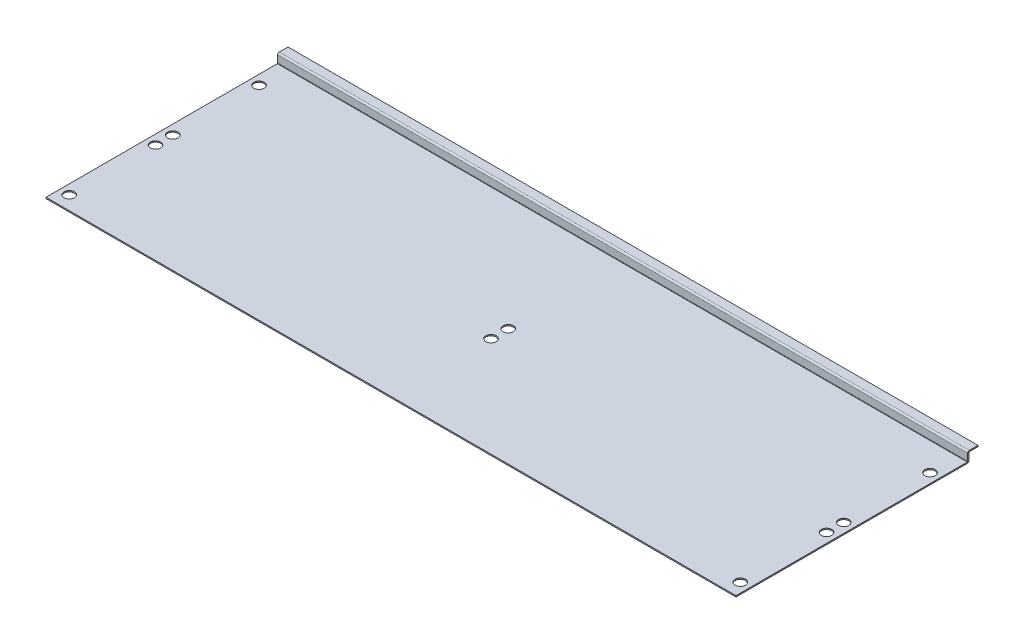
ISO-10303-21;
HEADER;
FILE_DESCRIPTION(('STEP AP214'),'2;1');
FILE_NAME('part.step','',(''),(''),'','','');
FILE_SCHEMA(('AUTOMOTIVE_DESIGN { 1 0 10303 214 1 1 1 1 }'));
ENDSEC;
DATA;
#1=APPLICATION_CONTEXT('core data for automotive mechanical design processes');
#2=APPLICATION_PROTOCOL_DEFINITION('international standard','automotive_design',2000,#1);
#3=PRODUCT_CONTEXT('',#1,'mechanical');
#4=PRODUCT('Part','Part','',(#3));
#5=PRODUCT_RELATED_PRODUCT_CATEGORY('part','',(#4));
#6=PRODUCT_DEFINITION_FORMATION('','',#4);
#7=PRODUCT_DEFINITION_CONTEXT('part definition',#1,'design');
#8=PRODUCT_DEFINITION('design','',#6,#7);
#9=PRODUCT_DEFINITION_SHAPE('','',#8);
#10=(LENGTH_UNIT() NAMED_UNIT(*) SI_UNIT(.MILLI.,.METRE.));
#11=(NAMED_UNIT(*) PLANE_ANGLE_UNIT() SI_UNIT($,.RADIAN.));
#12=(NAMED_UNIT(*) SI_UNIT($,.STERADIAN.) SOLID_ANGLE_UNIT());
#13=UNCERTAINTY_MEASURE_WITH_UNIT(LENGTH_MEASURE(1.E-05),#10,'distance_accuracy_value','');
#14=(GEOMETRIC_REPRESENTATION_CONTEXT(3) GLOBAL_UNCERTAINTY_ASSIGNED_CONTEXT((#13)) GLOBAL_UNIT_ASSIGNED_CONTEXT((#10,
#11,#12)) REPRESENTATION_CONTEXT('',''));
#15=CARTESIAN_POINT('',(0.,0.,0.));
#16=DIRECTION('',(0.,0.,1.));
#17=DIRECTION('',(1.,0.,0.));
#18=AXIS2_PLACEMENT_3D('',#15,#16,#17);
#19=CARTESIAN_POINT('',(200.,4.6,-67.5));
#20=DIRECTION('',(-1.,0.,0.));
#21=DIRECTION('',(0.,0.,1.));
#22=AXIS2_PLACEMENT_3D('',#19,#20,#21);
#23=PLANE('',#22);
#24=DIRECTION('',(0.,0.,1.));
#25=VECTOR('',#24,1.);
#26=CARTESIAN_POINT('',(200.,3.70000000000001,-67.5));
#27=LINE('',#26,#25);
#28=CARTESIAN_POINT('',(200.,3.70000000000001,-67.5));
#29=VERTEX_POINT('',#28);
#30=CARTESIAN_POINT('',(200.,3.70000000000001,-66.8));
#31=VERTEX_POINT('',#30);
#32=EDGE_CURVE('E247',#29,#31,#27,.T.);
#33=ORIENTED_EDGE('',*,*,#32,.T.);
#34=DIRECTION('',(0.,-1.,0.));
#35=VECTOR('',#34,1.);
#36=CARTESIAN_POINT('',(200.,4.6,-66.8));
#37=LINE('',#36,#35);
#38=CARTESIAN_POINT('',(200.,-0.499999999999987,-66.8));
#39=VERTEX_POINT('',#38);
#40=EDGE_CURVE('E268',#39,#31,#37,.F.);
#41=ORIENTED_EDGE('',*,*,#40,.F.);
#42=DIRECTION('',(0.,0.,1.));
#43=VECTOR('',#42,1.);
#44=CARTESIAN_POINT('',(200.,-0.499999999999988,-66.8));
#45=LINE('',#44,#43);
#46=CARTESIAN_POINT('',(200.,-0.499999999999993,-67.5));
#47=VERTEX_POINT('',#46);
#48=EDGE_CURVE('E276',#39,#47,#45,.F.);
#49=ORIENTED_EDGE('',*,*,#48,.T.);
#50=DIRECTION('',(0.,1.,0.));
#51=VECTOR('',#50,1.);
#52=CARTESIAN_POINT('',(200.,-1.40000000000018,-67.5));
#53=LINE('',#52,#51);
#54=EDGE_CURVE('E260',#47,#29,#53,.T.);
#55=ORIENTED_EDGE('',*,*,#54,.T.);
#56=EDGE_LOOP('',(#33,#41,#49,#55));
#57=FACE_BOUND('',#56,.T.);
#58=ADVANCED_FACE('F81',(#57),#23,.F.);
#59=CARTESIAN_POINT('',(-200.,-0.700000000000003,-67.5));
#60=DIRECTION('',(1.,0.,0.));
#61=DIRECTION('',(0.,0.,-1.));
#62=AXIS2_PLACEMENT_3D('',#59,#60,#61);
#63=PLANE('',#62);
#64=DIRECTION('',(0.,0.,1.));
#65=VECTOR('',#64,1.);
#66=CARTESIAN_POINT('',(-200.,3.70000000000001,-67.5));
#67=LINE('',#66,#65);
#68=CARTESIAN_POINT('',(-200.,3.70000000000001,-67.5));
#69=VERTEX_POINT('',#68);
#70=CARTESIAN_POINT('',(-200.,3.70000000000001,-66.8));
#71=VERTEX_POINT('',#70);
#72=EDGE_CURVE('E234',#69,#71,#67,.T.);
#73=ORIENTED_EDGE('',*,*,#72,.F.);
#74=DIRECTION('',(0.,-1.,0.));
#75=VECTOR('',#74,1.);
#76=CARTESIAN_POINT('',(-200.,-1.40000000000018,-67.5));
#77=LINE('',#76,#75);
#78=CARTESIAN_POINT('',(-200.,-0.499999999999989,-67.5));
#79=VERTEX_POINT('',#78);
#80=EDGE_CURVE('E255',#69,#79,#77,.T.);
#81=ORIENTED_EDGE('',*,*,#80,.T.);
#82=DIRECTION('',(0.,0.,1.));
#83=VECTOR('',#82,1.);
#84=CARTESIAN_POINT('',(-200.,-0.499999999999993,-67.5));
#85=LINE('',#84,#83);
#86=CARTESIAN_POINT('',(-200.,-0.499999999999987,-66.8));
#87=VERTEX_POINT('',#86);
#88=EDGE_CURVE('E251',#87,#79,#85,.F.);
#89=ORIENTED_EDGE('',*,*,#88,.F.);
#90=DIRECTION('',(0.,1.,0.));
#91=VECTOR('',#90,1.);
#92=CARTESIAN_POINT('',(-200.,-0.700000000000001,-66.8));
#93=LINE('',#92,#91);
#94=EDGE_CURVE('E264',#71,#87,#93,.F.);
#95=ORIENTED_EDGE('',*,*,#94,.F.);
#96=EDGE_LOOP('',(#73,#81,#89,#95));
#97=FACE_BOUND('',#96,.T.);
#98=ADVANCED_FACE('F449',(#97),#63,.F.);
#99=CARTESIAN_POINT('',(0.,-1.40000000000018,-67.5));
#100=DIRECTION('',(0.,0.,1.));
#101=DIRECTION('',(0.,1.,0.));
#102=AXIS2_PLACEMENT_3D('',#99,#100,#101);
#103=PLANE('',#102);
#104=DIRECTION('',(-1.,0.,0.));
#105=VECTOR('',#104,1.);
#106=CARTESIAN_POINT('',(-200.,3.70000000000001,-67.5));
#107=LINE('',#106,#105);
#108=EDGE_CURVE('E241',#69,#29,#107,.F.);
#109=ORIENTED_EDGE('',*,*,#108,.T.);
#110=ORIENTED_EDGE('',*,*,#54,.F.);
#111=DIRECTION('',(1.,0.,0.));
#112=VECTOR('',#111,1.);
#113=CARTESIAN_POINT('',(-200.,-0.499999999999993,-67.5));
#114=LINE('',#113,#112);
#115=EDGE_CURVE('E272',#47,#79,#114,.F.);
#116=ORIENTED_EDGE('',*,*,#115,.T.);
#117=ORIENTED_EDGE('',*,*,#80,.F.);
#118=EDGE_LOOP('',(#109,#110,#116,#117));
#119=FACE_BOUND('',#118,.T.);
#120=ADVANCED_FACE('F451',(#119),#103,.F.);
#121=CARTESIAN_POINT('',(0.,-1.40000000000018,-66.8));
#122=DIRECTION('',(0.,0.,1.));
#123=DIRECTION('',(0.,1.,0.));
#124=AXIS2_PLACEMENT_3D('',#121,#122,#123);
#125=PLANE('',#124);
#126=ORIENTED_EDGE('',*,*,#94,.T.);
#127=DIRECTION('',(1.,0.,0.));
#128=VECTOR('',#127,1.);
#129=CARTESIAN_POINT('',(-200.,-0.499999999999988,-66.8));
#130=LINE('',#129,#128);
#131=EDGE_CURVE('E280',#87,#39,#130,.T.);
#132=ORIENTED_EDGE('',*,*,#131,.T.);
#133=ORIENTED_EDGE('',*,*,#40,.T.);
#134=DIRECTION('',(-1.,0.,0.));
#135=VECTOR('',#134,1.);
#136=CARTESIAN_POINT('',(-200.,3.70000000000001,-66.8));
#137=LINE('',#136,#135);
#138=EDGE_CURVE('E228',#71,#31,#137,.F.);
#139=ORIENTED_EDGE('',*,*,#138,.F.);
#140=EDGE_LOOP('',(#126,#132,#133,#139));
#141=FACE_BOUND('',#140,.T.);
#142=ADVANCED_FACE('F456',(#141),#125,.T.);
#143=CARTESIAN_POINT('',(200.,-0.7,-67.5));
#144=DIRECTION('',(1.,0.,0.));
#145=DIRECTION('',(0.,0.,-1.));
#146=AXIS2_PLACEMENT_3D('',#143,#144,#145);
#147=PLANE('',#146);
#148=DIRECTION('',(0.,0.,-1.));
#149=VECTOR('',#148,1.);
#150=CARTESIAN_POINT('',(200.,-0.7,-67.5));
#151=LINE('',#150,#149);
#152=CARTESIAN_POINT('',(200.,-0.7,67.5));
#153=VERTEX_POINT('',#152);
#154=CARTESIAN_POINT('',(200.,-0.699999999999992,-66.6));
#155=VERTEX_POINT('',#154);
#156=EDGE_CURVE('E392',#153,#155,#151,.T.);
#157=ORIENTED_EDGE('',*,*,#156,.F.);
#158=DIRECTION('',(0.,-1.,0.));
#159=VECTOR('',#158,1.);
#160=CARTESIAN_POINT('',(200.,-0.7,67.5));
#161=LINE('',#160,#159);
#162=CARTESIAN_POINT('',(200.,-1.4,67.5));
#163=VERTEX_POINT('',#162);
#164=EDGE_CURVE('E13',#153,#163,#161,.T.);
#165=ORIENTED_EDGE('',*,*,#164,.T.);
#166=DIRECTION('',(0.,0.,-1.));
#167=VECTOR('',#166,1.);
#168=CARTESIAN_POINT('',(200.,-1.4,-67.5));
#169=LINE('',#168,#167);
#170=CARTESIAN_POINT('',(200.,-1.39999999999999,-66.6));
#171=VERTEX_POINT('',#170);
#172=EDGE_CURVE('E388',#163,#171,#169,.T.);
#173=ORIENTED_EDGE('',*,*,#172,.T.);
#174=DIRECTION('',(0.,-1.,0.));
#175=VECTOR('',#174,1.);
#176=CARTESIAN_POINT('',(200.,-0.699999999999992,-66.6));
#177=LINE('',#176,#175);
#178=EDGE_CURVE('E293',#155,#171,#177,.T.);
#179=ORIENTED_EDGE('',*,*,#178,.F.);
#180=EDGE_LOOP('',(#157,#165,#173,#179));
#181=FACE_BOUND('',#180,.T.);
#182=ADVANCED_FACE('F83',(#181),#147,.T.);
#183=CARTESIAN_POINT('',(0.,-0.7,0.));
#184=DIRECTION('',(0.,-1.,0.));
#185=DIRECTION('',(0.,0.,1.));
#186=AXIS2_PLACEMENT_3D('',#183,#184,#185);
#187=PLANE('',#186);
#188=CARTESIAN_POINT('',(-194.5,-0.7,59.5));
#189=DIRECTION('',(0.,1.,0.));
#190=DIRECTION('',(0.,0.,1.));
#191=AXIS2_PLACEMENT_3D('',#188,#189,#190);
#192=CIRCLE('',#191,2.99999999999999);
#193=CARTESIAN_POINT('',(-194.5,-0.7,62.5));
#194=VERTEX_POINT('',#193);
#195=EDGE_CURVE('E384',#194,#194,#192,.T.);
#196=ORIENTED_EDGE('',*,*,#195,.F.);
#197=EDGE_LOOP('',(#196));
#198=FACE_BOUND('',#197,.T.);
#199=CARTESIAN_POINT('',(-194.5,-0.7,9.5));
#200=DIRECTION('',(0.,1.,0.));
#201=DIRECTION('',(0.,0.,1.));
#202=AXIS2_PLACEMENT_3D('',#199,#200,#201);
#203=CIRCLE('',#202,2.99999999999999);
#204=CARTESIAN_POINT('',(-194.5,-0.7,12.5));
#205=VERTEX_POINT('',#204);
#206=EDGE_CURVE('E376',#205,#205,#203,.T.);
#207=ORIENTED_EDGE('',*,*,#206,.F.);
#208=EDGE_LOOP('',(#207));
#209=FACE_BOUND('',#208,.T.);
#210=CARTESIAN_POINT('',(-194.5,-0.7,-0.499999999999999));
#211=DIRECTION('',(0.,1.,0.));
#212=DIRECTION('',(0.,0.,1.));
#213=AXIS2_PLACEMENT_3D('',#210,#211,#212);
#214=CIRCLE('',#213,2.99999999999999);
#215=CARTESIAN_POINT('',(-194.5,-0.7,2.5));
#216=VERTEX_POINT('',#215);
#217=EDGE_CURVE('E368',#216,#216,#214,.T.);
#218=ORIENTED_EDGE('',*,*,#217,.F.);
#219=EDGE_LOOP('',(#218));
#220=FACE_BOUND('',#219,.T.);
#221=CARTESIAN_POINT('',(-194.5,-0.7,-50.5));
#222=DIRECTION('',(0.,1.,0.));
#223=DIRECTION('',(0.,0.,1.));
#224=AXIS2_PLACEMENT_3D('',#221,#222,#223);
#225=CIRCLE('',#224,2.99999999999999);
#226=CARTESIAN_POINT('',(-194.5,-0.7,-47.5));
#227=VERTEX_POINT('',#226);
#228=EDGE_CURVE('E360',#227,#227,#225,.T.);
#229=ORIENTED_EDGE('',*,*,#228,.F.);
#230=EDGE_LOOP('',(#229));
#231=FACE_BOUND('',#230,.T.);
#232=CARTESIAN_POINT('',(194.5,-0.7,59.5));
#233=DIRECTION('',(0.,1.,0.));
#234=DIRECTION('',(0.,0.,-1.));
#235=AXIS2_PLACEMENT_3D('',#232,#233,#234);
#236=CIRCLE('',#235,2.99999999999999);
#237=CARTESIAN_POINT('',(194.5,-0.7,56.5));
#238=VERTEX_POINT('',#237);
#239=EDGE_CURVE('E352',#238,#238,#236,.T.);
#240=ORIENTED_EDGE('',*,*,#239,.F.);
#241=EDGE_LOOP('',(#240));
#242=FACE_BOUND('',#241,.T.);
#243=CARTESIAN_POINT('',(194.5,-0.7,9.49999999999995));
#244=DIRECTION('',(0.,1.,0.));
#245=DIRECTION('',(0.,0.,-1.));
#246=AXIS2_PLACEMENT_3D('',#243,#244,#245);
#247=CIRCLE('',#246,2.99999999999999);
#248=CARTESIAN_POINT('',(194.5,-0.7,6.49999999999996));
#249=VERTEX_POINT('',#248);
#250=EDGE_CURVE('E344',#249,#249,#247,.T.);
#251=ORIENTED_EDGE('',*,*,#250,.F.);
#252=EDGE_LOOP('',(#251));
#253=FACE_BOUND('',#252,.T.);
#254=CARTESIAN_POINT('',(194.5,-0.7,-0.500000000000046));
#255=DIRECTION('',(0.,1.,0.));
#256=DIRECTION('',(0.,0.,-1.));
#257=AXIS2_PLACEMENT_3D('',#254,#255,#256);
#258=CIRCLE('',#257,2.99999999999999);
#259=CARTESIAN_POINT('',(194.5,-0.7,-3.50000000000004));
#260=VERTEX_POINT('',#259);
#261=EDGE_CURVE('E336',#260,#260,#258,.T.);
#262=ORIENTED_EDGE('',*,*,#261,.F.);
#263=EDGE_LOOP('',(#262));
#264=FACE_BOUND('',#263,.T.);
#265=CARTESIAN_POINT('',(194.5,-0.7,-50.5));
#266=DIRECTION('',(0.,1.,0.));
#267=DIRECTION('',(0.,0.,-1.));
#268=AXIS2_PLACEMENT_3D('',#265,#266,#267);
#269=CIRCLE('',#268,2.99999999999999);
#270=CARTESIAN_POINT('',(194.5,-0.7,-53.5));
#271=VERTEX_POINT('',#270);
#272=EDGE_CURVE('E328',#271,#271,#269,.T.);
#273=ORIENTED_EDGE('',*,*,#272,.F.);
#274=EDGE_LOOP('',(#273));
#275=FACE_BOUND('',#274,.T.);
#276=CARTESIAN_POINT('',(0.,-0.7,9.5));
#277=DIRECTION('',(0.,1.,0.));
#278=DIRECTION('',(0.,0.,1.));
#279=AXIS2_PLACEMENT_3D('',#276,#277,#278);
#280=CIRCLE('',#279,3.);
#281=CARTESIAN_POINT('',(0.,-0.7,12.5));
#282=VERTEX_POINT('',#281);
#283=EDGE_CURVE('E320',#282,#282,#280,.T.);
#284=ORIENTED_EDGE('',*,*,#283,.F.);
#285=EDGE_LOOP('',(#284));
#286=FACE_BOUND('',#285,.T.);
#287=CARTESIAN_POINT('',(0.,-0.7,-0.499999999999999));
#288=DIRECTION('',(0.,1.,0.));
#289=DIRECTION('',(0.,0.,1.));
#290=AXIS2_PLACEMENT_3D('',#287,#288,#289);
#291=CIRCLE('',#290,3.);
#292=CARTESIAN_POINT('',(0.,-0.7,2.5));
#293=VERTEX_POINT('',#292);
#294=EDGE_CURVE('E312',#293,#293,#291,.T.);
#295=ORIENTED_EDGE('',*,*,#294,.F.);
#296=EDGE_LOOP('',(#295));
#297=FACE_BOUND('',#296,.T.);
#298=DIRECTION('',(1.,0.,0.));
#299=VECTOR('',#298,1.);
#300=CARTESIAN_POINT('',(200.,-0.699999999999992,-66.6));
#301=LINE('',#300,#299);
#302=CARTESIAN_POINT('',(-200.,-0.699999999999992,-66.6));
#303=VERTEX_POINT('',#302);
#304=EDGE_CURVE('E299',#155,#303,#301,.F.);
#305=ORIENTED_EDGE('',*,*,#304,.T.);
#306=DIRECTION('',(0.,0.,1.));
#307=VECTOR('',#306,1.);
#308=CARTESIAN_POINT('',(-200.,-0.7,-67.5));
#309=LINE('',#308,#307);
#310=CARTESIAN_POINT('',(-200.,-0.7,67.5));
#311=VERTEX_POINT('',#310);
#312=EDGE_CURVE('E396',#303,#311,#309,.T.);
#313=ORIENTED_EDGE('',*,*,#312,.T.);
#314=DIRECTION('',(1.,0.,0.));
#315=VECTOR('',#314,1.);
#316=CARTESIAN_POINT('',(-200.,-0.7,67.5));
#317=LINE('',#316,#315);
#318=EDGE_CURVE('E401',#311,#153,#317,.T.);
#319=ORIENTED_EDGE('',*,*,#318,.T.);
#320=ORIENTED_EDGE('',*,*,#156,.T.);
#321=EDGE_LOOP('',(#305,#313,#319,#320));
#322=FACE_BOUND('',#321,.T.);
#323=ADVANCED_FACE('F426',(#198,#209,#220,#231,#242,#253,#264,#275,#286,#297,#322),#187,.F.);
#324=CARTESIAN_POINT('',(0.,-1.4,0.));
#325=DIRECTION('',(0.,-1.,0.));
#326=DIRECTION('',(0.,0.,1.));
#327=AXIS2_PLACEMENT_3D('',#324,#325,#326);
#328=PLANE('',#327);
#329=CARTESIAN_POINT('',(0.,-1.4,-0.499999999999999));
#330=DIRECTION('',(0.,1.,0.));
#331=DIRECTION('',(0.,0.,1.));
#332=AXIS2_PLACEMENT_3D('',#329,#330,#331);
#333=CIRCLE('',#332,3.);
#334=CARTESIAN_POINT('',(0.,-1.4,2.5));
#335=VERTEX_POINT('',#334);
#336=EDGE_CURVE('E308',#335,#335,#333,.T.);
#337=ORIENTED_EDGE('',*,*,#336,.T.);
#338=EDGE_LOOP('',(#337));
#339=FACE_BOUND('',#338,.T.);
#340=CARTESIAN_POINT('',(0.,-1.4,9.5));
#341=DIRECTION('',(0.,1.,0.));
#342=DIRECTION('',(0.,0.,1.));
#343=AXIS2_PLACEMENT_3D('',#340,#341,#342);
#344=CIRCLE('',#343,3.);
#345=CARTESIAN_POINT('',(0.,-1.4,12.5));
#346=VERTEX_POINT('',#345);
#347=EDGE_CURVE('E316',#346,#346,#344,.T.);
#348=ORIENTED_EDGE('',*,*,#347,.T.);
#349=EDGE_LOOP('',(#348));
#350=FACE_BOUND('',#349,.T.);
#351=CARTESIAN_POINT('',(194.5,-1.4,-50.5));
#352=DIRECTION('',(0.,1.,0.));
#353=DIRECTION('',(0.,0.,-1.));
#354=AXIS2_PLACEMENT_3D('',#351,#352,#353);
#355=CIRCLE('',#354,2.99999999999999);
#356=CARTESIAN_POINT('',(194.5,-1.4,-53.5));
#357=VERTEX_POINT('',#356);
#358=EDGE_CURVE('E324',#357,#357,#355,.T.);
#359=ORIENTED_EDGE('',*,*,#358,.T.);
#360=EDGE_LOOP('',(#359));
#361=FACE_BOUND('',#360,.T.);
#362=CARTESIAN_POINT('',(194.5,-1.4,-0.500000000000046));
#363=DIRECTION('',(0.,1.,0.));
#364=DIRECTION('',(0.,0.,-1.));
#365=AXIS2_PLACEMENT_3D('',#362,#363,#364);
#366=CIRCLE('',#365,2.99999999999999);
#367=CARTESIAN_POINT('',(194.5,-1.4,-3.50000000000004));
#368=VERTEX_POINT('',#367);
#369=EDGE_CURVE('E332',#368,#368,#366,.T.);
#370=ORIENTED_EDGE('',*,*,#369,.T.);
#371=EDGE_LOOP('',(#370));
#372=FACE_BOUND('',#371,.T.);
#373=CARTESIAN_POINT('',(194.5,-1.4,9.49999999999995));
#374=DIRECTION('',(0.,1.,0.));
#375=DIRECTION('',(0.,0.,-1.));
#376=AXIS2_PLACEMENT_3D('',#373,#374,#375);
#377=CIRCLE('',#376,2.99999999999999);
#378=CARTESIAN_POINT('',(194.5,-1.4,6.49999999999996));
#379=VERTEX_POINT('',#378);
#380=EDGE_CURVE('E340',#379,#379,#377,.T.);
#381=ORIENTED_EDGE('',*,*,#380,.T.);
#382=EDGE_LOOP('',(#381));
#383=FACE_BOUND('',#382,.T.);
#384=CARTESIAN_POINT('',(194.5,-1.4,59.5));
#385=DIRECTION('',(0.,1.,0.));
#386=DIRECTION('',(0.,0.,-1.));
#387=AXIS2_PLACEMENT_3D('',#384,#385,#386);
#388=CIRCLE('',#387,2.99999999999999);
#389=CARTESIAN_POINT('',(194.5,-1.4,56.5));
#390=VERTEX_POINT('',#389);
#391=EDGE_CURVE('E348',#390,#390,#388,.T.);
#392=ORIENTED_EDGE('',*,*,#391,.T.);
#393=EDGE_LOOP('',(#392));
#394=FACE_BOUND('',#393,.T.);
#395=CARTESIAN_POINT('',(-194.5,-1.4,-50.5));
#396=DIRECTION('',(0.,1.,0.));
#397=DIRECTION('',(0.,0.,1.));
#398=AXIS2_PLACEMENT_3D('',#395,#396,#397);
#399=CIRCLE('',#398,2.99999999999999);
#400=CARTESIAN_POINT('',(-194.5,-1.4,-47.5));
#401=VERTEX_POINT('',#400);
#402=EDGE_CURVE('E356',#401,#401,#399,.T.);
#403=ORIENTED_EDGE('',*,*,#402,.T.);
#404=EDGE_LOOP('',(#403));
#405=FACE_BOUND('',#404,.T.);
#406=CARTESIAN_POINT('',(-194.5,-1.4,-0.499999999999999));
#407=DIRECTION('',(0.,1.,0.));
#408=DIRECTION('',(0.,0.,1.));
#409=AXIS2_PLACEMENT_3D('',#406,#407,#408);
#410=CIRCLE('',#409,2.99999999999999);
#411=CARTESIAN_POINT('',(-194.5,-1.4,2.5));
#412=VERTEX_POINT('',#411);
#413=EDGE_CURVE('E364',#412,#412,#410,.T.);
#414=ORIENTED_EDGE('',*,*,#413,.T.);
#415=EDGE_LOOP('',(#414));
#416=FACE_BOUND('',#415,.T.);
#417=CARTESIAN_POINT('',(-194.5,-1.4,9.5));
#418=DIRECTION('',(0.,1.,0.));
#419=DIRECTION('',(0.,0.,1.));
#420=AXIS2_PLACEMENT_3D('',#417,#418,#419);
#421=CIRCLE('',#420,2.99999999999999);
#422=CARTESIAN_POINT('',(-194.5,-1.4,12.5));
#423=VERTEX_POINT('',#422);
#424=EDGE_CURVE('E372',#423,#423,#421,.T.);
#425=ORIENTED_EDGE('',*,*,#424,.T.);
#426=EDGE_LOOP('',(#425));
#427=FACE_BOUND('',#426,.T.);
#428=CARTESIAN_POINT('',(-194.5,-1.4,59.5));
#429=DIRECTION('',(0.,1.,0.));
#430=DIRECTION('',(0.,0.,1.));
#431=AXIS2_PLACEMENT_3D('',#428,#429,#430);
#432=CIRCLE('',#431,2.99999999999999);
#433=CARTESIAN_POINT('',(-194.5,-1.4,62.5));
#434=VERTEX_POINT('',#433);
#435=EDGE_CURVE('E380',#434,#434,#432,.T.);
#436=ORIENTED_EDGE('',*,*,#435,.T.);
#437=EDGE_LOOP('',(#436));
#438=FACE_BOUND('',#437,.T.);
#439=ORIENTED_EDGE('',*,*,#172,.F.);
#440=DIRECTION('',(1.,0.,0.));
#441=VECTOR('',#440,1.);
#442=CARTESIAN_POINT('',(-200.,-1.4,67.5));
#443=LINE('',#442,#441);
#444=CARTESIAN_POINT('',(-200.,-1.4,67.5));
#445=VERTEX_POINT('',#444);
#446=EDGE_CURVE('E397',#445,#163,#443,.T.);
#447=ORIENTED_EDGE('',*,*,#446,.F.);
#448=DIRECTION('',(0.,0.,1.));
#449=VECTOR('',#448,1.);
#450=CARTESIAN_POINT('',(-200.,-1.4,-67.5));
#451=LINE('',#450,#449);
#452=CARTESIAN_POINT('',(-200.,-1.4,-66.6));
#453=VERTEX_POINT('',#452);
#454=EDGE_CURVE('E407',#453,#445,#451,.T.);
#455=ORIENTED_EDGE('',*,*,#454,.F.);
#456=DIRECTION('',(1.,0.,0.));
#457=VECTOR('',#456,1.);
#458=CARTESIAN_POINT('',(200.,-1.39999999999999,-66.6));
#459=LINE('',#458,#457);
#460=EDGE_CURVE('E286',#171,#453,#459,.F.);
#461=ORIENTED_EDGE('',*,*,#460,.F.);
#462=EDGE_LOOP('',(#439,#447,#455,#461));
#463=FACE_BOUND('',#462,.T.);
#464=ADVANCED_FACE('F422',(#339,#350,#361,#372,#383,#394,#405,#416,#427,#438,#463),#328,.T.);
#465=CARTESIAN_POINT('',(-200.,-0.7,67.5));
#466=DIRECTION('',(0.,0.,1.));
#467=DIRECTION('',(1.,0.,0.));
#468=AXIS2_PLACEMENT_3D('',#465,#466,#467);
#469=PLANE('',#468);
#470=ORIENTED_EDGE('',*,*,#446,.T.);
#471=ORIENTED_EDGE('',*,*,#164,.F.);
#472=ORIENTED_EDGE('',*,*,#318,.F.);
#473=DIRECTION('',(0.,-1.,0.));
#474=VECTOR('',#473,1.);
#475=CARTESIAN_POINT('',(-200.,-0.7,67.5));
#476=LINE('',#475,#474);
#477=EDGE_CURVE('E85',#311,#445,#476,.T.);
#478=ORIENTED_EDGE('',*,*,#477,.T.);
#479=EDGE_LOOP('',(#470,#471,#472,#478));
#480=FACE_BOUND('',#479,.T.);
#481=ADVANCED_FACE('F416',(#480),#469,.T.);
#482=CARTESIAN_POINT('',(-200.,-0.7,-67.5));
#483=DIRECTION('',(-1.,0.,0.));
#484=DIRECTION('',(0.,0.,1.));
#485=AXIS2_PLACEMENT_3D('',#482,#483,#484);
#486=PLANE('',#485);
#487=DIRECTION('',(0.,-1.,0.));
#488=VECTOR('',#487,1.);
#489=CARTESIAN_POINT('',(-200.,-0.699999999999992,-66.6));
#490=LINE('',#489,#488);
#491=EDGE_CURVE('E305',#303,#453,#490,.T.);
#492=ORIENTED_EDGE('',*,*,#491,.T.);
#493=ORIENTED_EDGE('',*,*,#454,.T.);
#494=ORIENTED_EDGE('',*,*,#477,.F.);
#495=ORIENTED_EDGE('',*,*,#312,.F.);
#496=EDGE_LOOP('',(#492,#493,#494,#495));
#497=FACE_BOUND('',#496,.T.);
#498=ADVANCED_FACE('F430',(#497),#486,.T.);
#499=CARTESIAN_POINT('',(-194.5,-0.7,59.5));
#500=DIRECTION('',(0.,-1.,0.));
#501=DIRECTION('',(0.,0.,1.));
#502=AXIS2_PLACEMENT_3D('',#499,#500,#501);
#503=CYLINDRICAL_SURFACE('',#502,2.99999999999999);
#504=ORIENTED_EDGE('',*,*,#195,.T.);
#505=EDGE_LOOP('',(#504));
#506=FACE_BOUND('',#505,.T.);
#507=ORIENTED_EDGE('',*,*,#435,.F.);
#508=EDGE_LOOP('',(#507));
#509=FACE_BOUND('',#508,.T.);
#510=ADVANCED_FACE('F525',(#506,#509),#503,.F.);
#511=CARTESIAN_POINT('',(-194.5,-0.7,9.5));
#512=DIRECTION('',(0.,-1.,0.));
#513=DIRECTION('',(0.,0.,1.));
#514=AXIS2_PLACEMENT_3D('',#511,#512,#513);
#515=CYLINDRICAL_SURFACE('',#514,2.99999999999999);
#516=ORIENTED_EDGE('',*,*,#206,.T.);
#517=EDGE_LOOP('',(#516));
#518=FACE_BOUND('',#517,.T.);
#519=ORIENTED_EDGE('',*,*,#424,.F.);
#520=EDGE_LOOP('',(#519));
#521=FACE_BOUND('',#520,.T.);
#522=ADVANCED_FACE('F521',(#518,#521),#515,.F.);
#523=CARTESIAN_POINT('',(-194.5,-0.7,-0.499999999999999));
#524=DIRECTION('',(0.,-1.,0.));
#525=DIRECTION('',(0.,0.,1.));
#526=AXIS2_PLACEMENT_3D('',#523,#524,#525);
#527=CYLINDRICAL_SURFACE('',#526,2.99999999999999);
#528=ORIENTED_EDGE('',*,*,#217,.T.);
#529=EDGE_LOOP('',(#528));
#530=FACE_BOUND('',#529,.T.);
#531=ORIENTED_EDGE('',*,*,#413,.F.);
#532=EDGE_LOOP('',(#531));
#533=FACE_BOUND('',#532,.T.);
#534=ADVANCED_FACE('F517',(#530,#533),#527,.F.);
#535=CARTESIAN_POINT('',(-194.5,-0.7,-50.5));
#536=DIRECTION('',(0.,-1.,0.));
#537=DIRECTION('',(0.,0.,1.));
#538=AXIS2_PLACEMENT_3D('',#535,#536,#537);
#539=CYLINDRICAL_SURFACE('',#538,2.99999999999999);
#540=ORIENTED_EDGE('',*,*,#228,.T.);
#541=EDGE_LOOP('',(#540));
#542=FACE_BOUND('',#541,.T.);
#543=ORIENTED_EDGE('',*,*,#402,.F.);
#544=EDGE_LOOP('',(#543));
#545=FACE_BOUND('',#544,.T.);
#546=ADVANCED_FACE('F513',(#542,#545),#539,.F.);
#547=CARTESIAN_POINT('',(194.5,-0.7,59.5));
#548=DIRECTION('',(0.,-1.,0.));
#549=DIRECTION('',(0.,0.,1.));
#550=AXIS2_PLACEMENT_3D('',#547,#548,#549);
#551=CYLINDRICAL_SURFACE('',#550,2.99999999999999);
#552=ORIENTED_EDGE('',*,*,#239,.T.);
#553=EDGE_LOOP('',(#552));
#554=FACE_BOUND('',#553,.T.);
#555=ORIENTED_EDGE('',*,*,#391,.F.);
#556=EDGE_LOOP('',(#555));
#557=FACE_BOUND('',#556,.T.);
#558=ADVANCED_FACE('F509',(#554,#557),#551,.F.);
#559=CARTESIAN_POINT('',(194.5,-0.7,9.49999999999995));
#560=DIRECTION('',(0.,-1.,0.));
#561=DIRECTION('',(0.,0.,1.));
#562=AXIS2_PLACEMENT_3D('',#559,#560,#561);
#563=CYLINDRICAL_SURFACE('',#562,2.99999999999999);
#564=ORIENTED_EDGE('',*,*,#250,.T.);
#565=EDGE_LOOP('',(#564));
#566=FACE_BOUND('',#565,.T.);
#567=ORIENTED_EDGE('',*,*,#380,.F.);
#568=EDGE_LOOP('',(#567));
#569=FACE_BOUND('',#568,.T.);
#570=ADVANCED_FACE('F505',(#566,#569),#563,.F.);
#571=CARTESIAN_POINT('',(194.5,-0.7,-0.500000000000046));
#572=DIRECTION('',(0.,-1.,0.));
#573=DIRECTION('',(0.,0.,1.));
#574=AXIS2_PLACEMENT_3D('',#571,#572,#573);
#575=CYLINDRICAL_SURFACE('',#574,2.99999999999999);
#576=ORIENTED_EDGE('',*,*,#261,.T.);
#577=EDGE_LOOP('',(#576));
#578=FACE_BOUND('',#577,.T.);
#579=ORIENTED_EDGE('',*,*,#369,.F.);
#580=EDGE_LOOP('',(#579));
#581=FACE_BOUND('',#580,.T.);
#582=ADVANCED_FACE('F501',(#578,#581),#575,.F.);
#583=CARTESIAN_POINT('',(194.5,-0.7,-50.5));
#584=DIRECTION('',(0.,-1.,0.));
#585=DIRECTION('',(0.,0.,1.));
#586=AXIS2_PLACEMENT_3D('',#583,#584,#585);
#587=CYLINDRICAL_SURFACE('',#586,2.99999999999999);
#588=ORIENTED_EDGE('',*,*,#272,.T.);
#589=EDGE_LOOP('',(#588));
#590=FACE_BOUND('',#589,.T.);
#591=ORIENTED_EDGE('',*,*,#358,.F.);
#592=EDGE_LOOP('',(#591));
#593=FACE_BOUND('',#592,.T.);
#594=ADVANCED_FACE('F497',(#590,#593),#587,.F.);
#595=CARTESIAN_POINT('',(0.,-0.7,9.5));
#596=DIRECTION('',(0.,-1.,0.));
#597=DIRECTION('',(0.,0.,1.));
#598=AXIS2_PLACEMENT_3D('',#595,#596,#597);
#599=CYLINDRICAL_SURFACE('',#598,3.);
#600=ORIENTED_EDGE('',*,*,#283,.T.);
#601=EDGE_LOOP('',(#600));
#602=FACE_BOUND('',#601,.T.);
#603=ORIENTED_EDGE('',*,*,#347,.F.);
#604=EDGE_LOOP('',(#603));
#605=FACE_BOUND('',#604,.T.);
#606=ADVANCED_FACE('F493',(#602,#605),#599,.F.);
#607=CARTESIAN_POINT('',(0.,-0.7,-0.499999999999999));
#608=DIRECTION('',(0.,-1.,0.));
#609=DIRECTION('',(0.,0.,1.));
#610=AXIS2_PLACEMENT_3D('',#607,#608,#609);
#611=CYLINDRICAL_SURFACE('',#610,3.);
#612=ORIENTED_EDGE('',*,*,#294,.T.);
#613=EDGE_LOOP('',(#612));
#614=FACE_BOUND('',#613,.T.);
#615=ORIENTED_EDGE('',*,*,#336,.F.);
#616=EDGE_LOOP('',(#615));
#617=FACE_BOUND('',#616,.T.);
#618=ADVANCED_FACE('F488',(#614,#617),#611,.F.);
#619=CARTESIAN_POINT('',(-200.,-0.499999999999987,-66.6));
#620=DIRECTION('',(-1.,0.,0.));
#621=DIRECTION('',(0.,0.,1.));
#622=AXIS2_PLACEMENT_3D('',#619,#620,#621);
#623=PLANE('',#622);
#624=ORIENTED_EDGE('',*,*,#88,.T.);
#625=CARTESIAN_POINT('',(-200.,-0.499999999999987,-66.6));
#626=DIRECTION('',(-1.,0.,0.));
#627=DIRECTION('',(0.,0.,-1.));
#628=AXIS2_PLACEMENT_3D('',#625,#626,#627);
#629=CIRCLE('',#628,0.900000000000006);
#630=EDGE_CURVE('E105',#453,#79,#629,.F.);
#631=ORIENTED_EDGE('',*,*,#630,.F.);
#632=ORIENTED_EDGE('',*,*,#491,.F.);
#633=CARTESIAN_POINT('',(-200.,-0.499999999999987,-66.6));
#634=DIRECTION('',(-1.,0.,0.));
#635=DIRECTION('',(0.,0.,-1.));
#636=AXIS2_PLACEMENT_3D('',#633,#634,#635);
#637=CIRCLE('',#636,0.200000000000006);
#638=EDGE_CURVE('E296',#303,#87,#637,.F.);
#639=ORIENTED_EDGE('',*,*,#638,.T.);
#640=EDGE_LOOP('',(#624,#631,#632,#639));
#641=FACE_BOUND('',#640,.T.);
#642=ADVANCED_FACE('F443',(#641),#623,.T.);
#643=CARTESIAN_POINT('',(200.,-0.499999999999987,-66.6));
#644=DIRECTION('',(-1.,0.,0.));
#645=DIRECTION('',(0.,0.,1.));
#646=AXIS2_PLACEMENT_3D('',#643,#644,#645);
#647=PLANE('',#646);
#648=CARTESIAN_POINT('',(200.,-0.499999999999987,-66.6));
#649=DIRECTION('',(-1.,0.,0.));
#650=DIRECTION('',(0.,0.,-1.));
#651=AXIS2_PLACEMENT_3D('',#648,#649,#650);
#652=CIRCLE('',#651,0.200000000000006);
#653=EDGE_CURVE('E259',#39,#155,#652,.T.);
#654=ORIENTED_EDGE('',*,*,#653,.T.);
#655=ORIENTED_EDGE('',*,*,#178,.T.);
#656=CARTESIAN_POINT('',(200.,-0.499999999999987,-66.6));
#657=DIRECTION('',(-1.,0.,0.));
#658=DIRECTION('',(0.,0.,-1.));
#659=AXIS2_PLACEMENT_3D('',#656,#657,#658);
#660=CIRCLE('',#659,0.900000000000006);
#661=EDGE_CURVE('E290',#47,#171,#660,.T.);
#662=ORIENTED_EDGE('',*,*,#661,.F.);
#663=ORIENTED_EDGE('',*,*,#48,.F.);
#664=EDGE_LOOP('',(#654,#655,#662,#663));
#665=FACE_BOUND('',#664,.T.);
#666=ADVANCED_FACE('F438',(#665),#647,.F.);
#667=CARTESIAN_POINT('',(200.,-0.499999999999987,-66.6));
#668=DIRECTION('',(1.,0.,0.));
#669=DIRECTION('',(0.,0.,-1.));
#670=AXIS2_PLACEMENT_3D('',#667,#668,#669);
#671=CYLINDRICAL_SURFACE('',#670,0.900000000000006);
#672=ORIENTED_EDGE('',*,*,#460,.T.);
#673=ORIENTED_EDGE('',*,*,#630,.T.);
#674=ORIENTED_EDGE('',*,*,#115,.F.);
#675=ORIENTED_EDGE('',*,*,#661,.T.);
#676=EDGE_LOOP('',(#672,#673,#674,#675));
#677=FACE_BOUND('',#676,.T.);
#678=ADVANCED_FACE('F433',(#677),#671,.T.);
#679=CARTESIAN_POINT('',(200.,-0.499999999999987,-66.6));
#680=DIRECTION('',(1.,0.,0.));
#681=DIRECTION('',(0.,0.,-1.));
#682=AXIS2_PLACEMENT_3D('',#679,#680,#681);
#683=CYLINDRICAL_SURFACE('',#682,0.200000000000006);
#684=ORIENTED_EDGE('',*,*,#304,.F.);
#685=ORIENTED_EDGE('',*,*,#653,.F.);
#686=ORIENTED_EDGE('',*,*,#131,.F.);
#687=ORIENTED_EDGE('',*,*,#638,.F.);
#688=EDGE_LOOP('',(#684,#685,#686,#687));
#689=FACE_BOUND('',#688,.T.);
#690=ADVANCED_FACE('F442',(#689),#683,.F.);
#691=CARTESIAN_POINT('',(200.,3.70000000000001,-67.7));
#692=DIRECTION('',(1.,0.,0.));
#693=DIRECTION('',(0.,0.,-1.));
#694=AXIS2_PLACEMENT_3D('',#691,#692,#693);
#695=PLANE('',#694);
#696=DIRECTION('',(0.,-1.,0.));
#697=VECTOR('',#696,1.);
#698=CARTESIAN_POINT('',(200.,4.6,-67.7));
#699=LINE('',#698,#697);
#700=CARTESIAN_POINT('',(200.,3.90000000000001,-67.7));
#701=VERTEX_POINT('',#700);
#702=CARTESIAN_POINT('',(200.,4.60000000000001,-67.7));
#703=VERTEX_POINT('',#702);
#704=EDGE_CURVE('E225',#701,#703,#699,.F.);
#705=ORIENTED_EDGE('',*,*,#704,.T.);
#706=CARTESIAN_POINT('',(200.,3.70000000000001,-67.7));
#707=DIRECTION('',(1.,0.,0.));
#708=DIRECTION('',(0.,0.,1.));
#709=AXIS2_PLACEMENT_3D('',#706,#707,#708);
#710=CIRCLE('',#709,0.9);
#711=EDGE_CURVE('E97',#31,#703,#710,.F.);
#712=ORIENTED_EDGE('',*,*,#711,.F.);
#713=ORIENTED_EDGE('',*,*,#32,.F.);
#714=CARTESIAN_POINT('',(200.,3.70000000000001,-67.7));
#715=DIRECTION('',(1.,0.,0.));
#716=DIRECTION('',(0.,0.,1.));
#717=AXIS2_PLACEMENT_3D('',#714,#715,#716);
#718=CIRCLE('',#717,0.200000000000001);
#719=EDGE_CURVE('E237',#29,#701,#718,.F.);
#720=ORIENTED_EDGE('',*,*,#719,.T.);
#721=EDGE_LOOP('',(#705,#712,#713,#720));
#722=FACE_BOUND('',#721,.T.);
#723=ADVANCED_FACE('F465',(#722),#695,.T.);
#724=CARTESIAN_POINT('',(-200.,3.70000000000001,-67.7));
#725=DIRECTION('',(1.,0.,0.));
#726=DIRECTION('',(0.,0.,-1.));
#727=AXIS2_PLACEMENT_3D('',#724,#725,#726);
#728=PLANE('',#727);
#729=CARTESIAN_POINT('',(-200.,3.70000000000001,-67.7));
#730=DIRECTION('',(1.,0.,0.));
#731=DIRECTION('',(0.,0.,1.));
#732=AXIS2_PLACEMENT_3D('',#729,#730,#731);
#733=CIRCLE('',#732,0.200000000000001);
#734=CARTESIAN_POINT('',(-200.,3.90000000000001,-67.7));
#735=VERTEX_POINT('',#734);
#736=EDGE_CURVE('E201',#735,#69,#733,.T.);
#737=ORIENTED_EDGE('',*,*,#736,.T.);
#738=ORIENTED_EDGE('',*,*,#72,.T.);
#739=CARTESIAN_POINT('',(-200.,3.70000000000001,-67.7));
#740=DIRECTION('',(1.,0.,0.));
#741=DIRECTION('',(0.,0.,1.));
#742=AXIS2_PLACEMENT_3D('',#739,#740,#741);
#743=CIRCLE('',#742,0.9);
#744=CARTESIAN_POINT('',(-200.,4.6,-67.7));
#745=VERTEX_POINT('',#744);
#746=EDGE_CURVE('E231',#745,#71,#743,.T.);
#747=ORIENTED_EDGE('',*,*,#746,.F.);
#748=DIRECTION('',(0.,-1.,0.));
#749=VECTOR('',#748,1.);
#750=CARTESIAN_POINT('',(-200.,3.90000000000001,-67.7));
#751=LINE('',#750,#749);
#752=EDGE_CURVE('E217',#735,#745,#751,.F.);
#753=ORIENTED_EDGE('',*,*,#752,.F.);
#754=EDGE_LOOP('',(#737,#738,#747,#753));
#755=FACE_BOUND('',#754,.T.);
#756=ADVANCED_FACE('F459',(#755),#728,.F.);
#757=CARTESIAN_POINT('',(-200.,3.70000000000001,-67.7));
#758=DIRECTION('',(-1.,0.,0.));
#759=DIRECTION('',(0.,1.,0.));
#760=AXIS2_PLACEMENT_3D('',#757,#758,#759);
#761=CYLINDRICAL_SURFACE('',#760,0.9);
#762=ORIENTED_EDGE('',*,*,#138,.T.);
#763=ORIENTED_EDGE('',*,*,#711,.T.);
#764=DIRECTION('',(-1.,0.,0.));
#765=VECTOR('',#764,1.);
#766=CARTESIAN_POINT('',(200.,4.6,-67.7));
#767=LINE('',#766,#765);
#768=EDGE_CURVE('E191',#745,#703,#767,.F.);
#769=ORIENTED_EDGE('',*,*,#768,.F.);
#770=ORIENTED_EDGE('',*,*,#746,.T.);
#771=EDGE_LOOP('',(#762,#763,#769,#770));
#772=FACE_BOUND('',#771,.T.);
#773=ADVANCED_FACE('F472',(#772),#761,.T.);
#774=CARTESIAN_POINT('',(-200.,3.70000000000001,-67.7));
#775=DIRECTION('',(-1.,0.,0.));
#776=DIRECTION('',(0.,1.,0.));
#777=AXIS2_PLACEMENT_3D('',#774,#775,#776);
#778=CYLINDRICAL_SURFACE('',#777,0.200000000000001);
#779=ORIENTED_EDGE('',*,*,#108,.F.);
#780=ORIENTED_EDGE('',*,*,#736,.F.);
#781=DIRECTION('',(-1.,0.,0.));
#782=VECTOR('',#781,1.);
#783=CARTESIAN_POINT('',(200.,3.90000000000001,-67.7));
#784=LINE('',#783,#782);
#785=EDGE_CURVE('E221',#701,#735,#784,.T.);
#786=ORIENTED_EDGE('',*,*,#785,.F.);
#787=ORIENTED_EDGE('',*,*,#719,.F.);
#788=EDGE_LOOP('',(#779,#780,#786,#787));
#789=FACE_BOUND('',#788,.T.);
#790=ADVANCED_FACE('F464',(#789),#778,.F.);
#791=CARTESIAN_POINT('',(-200.,4.6,-72.8));
#792=DIRECTION('',(1.,0.,0.));
#793=DIRECTION('',(0.,0.,-1.));
#794=AXIS2_PLACEMENT_3D('',#791,#792,#793);
#795=PLANE('',#794);
#796=ORIENTED_EDGE('',*,*,#752,.T.);
#797=DIRECTION('',(0.,0.,-1.));
#798=VECTOR('',#797,1.);
#799=CARTESIAN_POINT('',(-200.,4.59999999999994,0.));
#800=LINE('',#799,#798);
#801=CARTESIAN_POINT('',(-200.,4.6,-72.8));
#802=VERTEX_POINT('',#801);
#803=EDGE_CURVE('E186',#745,#802,#800,.T.);
#804=ORIENTED_EDGE('',*,*,#803,.T.);
#805=DIRECTION('',(0.,-1.,0.));
#806=VECTOR('',#805,1.);
#807=CARTESIAN_POINT('',(-200.,4.6,-72.8));
#808=LINE('',#807,#806);
#809=CARTESIAN_POINT('',(-200.,3.9,-72.8));
#810=VERTEX_POINT('',#809);
#811=EDGE_CURVE('E181',#802,#810,#808,.T.);
#812=ORIENTED_EDGE('',*,*,#811,.T.);
#813=DIRECTION('',(0.,0.,1.));
#814=VECTOR('',#813,1.);
#815=CARTESIAN_POINT('',(-200.,3.9,-72.8));
#816=LINE('',#815,#814);
#817=EDGE_CURVE('E211',#735,#810,#816,.F.);
#818=ORIENTED_EDGE('',*,*,#817,.F.);
#819=EDGE_LOOP('',(#796,#804,#812,#818));
#820=FACE_BOUND('',#819,.T.);
#821=ADVANCED_FACE('F626',(#820),#795,.F.);
#822=CARTESIAN_POINT('',(200.,4.6,-67.5));
#823=DIRECTION('',(-1.,0.,0.));
#824=DIRECTION('',(0.,0.,1.));
#825=AXIS2_PLACEMENT_3D('',#822,#823,#824);
#826=PLANE('',#825);
#827=ORIENTED_EDGE('',*,*,#704,.F.);
#828=DIRECTION('',(0.,0.,-1.));
#829=VECTOR('',#828,1.);
#830=CARTESIAN_POINT('',(200.,3.9,-67.5));
#831=LINE('',#830,#829);
#832=CARTESIAN_POINT('',(200.,3.9,-72.8));
#833=VERTEX_POINT('',#832);
#834=EDGE_CURVE('E197',#833,#701,#831,.F.);
#835=ORIENTED_EDGE('',*,*,#834,.F.);
#836=DIRECTION('',(0.,-1.,0.));
#837=VECTOR('',#836,1.);
#838=CARTESIAN_POINT('',(200.,4.6,-72.8));
#839=LINE('',#838,#837);
#840=CARTESIAN_POINT('',(200.,4.6,-72.8));
#841=VERTEX_POINT('',#840);
#842=EDGE_CURVE('E178',#841,#833,#839,.T.);
#843=ORIENTED_EDGE('',*,*,#842,.F.);
#844=DIRECTION('',(0.,0.,1.));
#845=VECTOR('',#844,1.);
#846=CARTESIAN_POINT('',(200.,4.59999999999994,0.));
#847=LINE('',#846,#845);
#848=EDGE_CURVE('E185',#841,#703,#847,.T.);
#849=ORIENTED_EDGE('',*,*,#848,.T.);
#850=EDGE_LOOP('',(#827,#835,#843,#849));
#851=FACE_BOUND('',#850,.T.);
#852=ADVANCED_FACE('F196',(#851),#826,.F.);
#853=CARTESIAN_POINT('',(0.,4.59999999999994,0.));
#854=DIRECTION('',(0.,-1.,0.));
#855=DIRECTION('',(0.,0.,1.));
#856=AXIS2_PLACEMENT_3D('',#853,#854,#855);
#857=PLANE('',#856);
#858=ORIENTED_EDGE('',*,*,#768,.T.);
#859=ORIENTED_EDGE('',*,*,#848,.F.);
#860=DIRECTION('',(1.,0.,0.));
#861=VECTOR('',#860,1.);
#862=CARTESIAN_POINT('',(0.,4.6,-72.8));
#863=LINE('',#862,#861);
#864=EDGE_CURVE('E174',#802,#841,#863,.T.);
#865=ORIENTED_EDGE('',*,*,#864,.F.);
#866=ORIENTED_EDGE('',*,*,#803,.F.);
#867=EDGE_LOOP('',(#858,#859,#865,#866));
#868=FACE_BOUND('',#867,.T.);
#869=ADVANCED_FACE('F189',(#868),#857,.F.);
#870=CARTESIAN_POINT('',(0.,3.89999999999994,0.));
#871=DIRECTION('',(0.,-1.,0.));
#872=DIRECTION('',(0.,0.,1.));
#873=AXIS2_PLACEMENT_3D('',#870,#871,#872);
#874=PLANE('',#873);
#875=ORIENTED_EDGE('',*,*,#817,.T.);
#876=DIRECTION('',(-1.,0.,0.));
#877=VECTOR('',#876,1.);
#878=CARTESIAN_POINT('',(200.,3.9,-72.8));
#879=LINE('',#878,#877);
#880=EDGE_CURVE('E208',#810,#833,#879,.F.);
#881=ORIENTED_EDGE('',*,*,#880,.T.);
#882=ORIENTED_EDGE('',*,*,#834,.T.);
#883=ORIENTED_EDGE('',*,*,#785,.T.);
#884=EDGE_LOOP('',(#875,#881,#882,#883));
#885=FACE_BOUND('',#884,.T.);
#886=ADVANCED_FACE('F651',(#885),#874,.T.);
#887=CARTESIAN_POINT('',(200.,4.6,-72.8));
#888=DIRECTION('',(0.,0.,1.));
#889=DIRECTION('',(0.,1.,0.));
#890=AXIS2_PLACEMENT_3D('',#887,#888,#889);
#891=PLANE('',#890);
#892=ORIENTED_EDGE('',*,*,#880,.F.);
#893=ORIENTED_EDGE('',*,*,#811,.F.);
#894=ORIENTED_EDGE('',*,*,#864,.T.);
#895=ORIENTED_EDGE('',*,*,#842,.T.);
#896=EDGE_LOOP('',(#892,#893,#894,#895));
#897=FACE_BOUND('',#896,.T.);
#898=ADVANCED_FACE('F176',(#897),#891,.F.);
#899=CLOSED_SHELL('',(#58,#98,#120,#142,#182,#323,#464,#481,#498,#510,#522,#534,#546,#558,#570,
#582,#594,#606,#618,#642,#666,#678,#690,#723,#756,#773,#790,#821,#852,#869,#886,#898));
#900=MANIFOLD_SOLID_BREP('B2',#899);
#901=ADVANCED_BREP_SHAPE_REPRESENTATION('',(#18,#900),#14);
#902=SHAPE_DEFINITION_REPRESENTATION(#9,#901);
ENDSEC;
END-ISO-10303-21;
